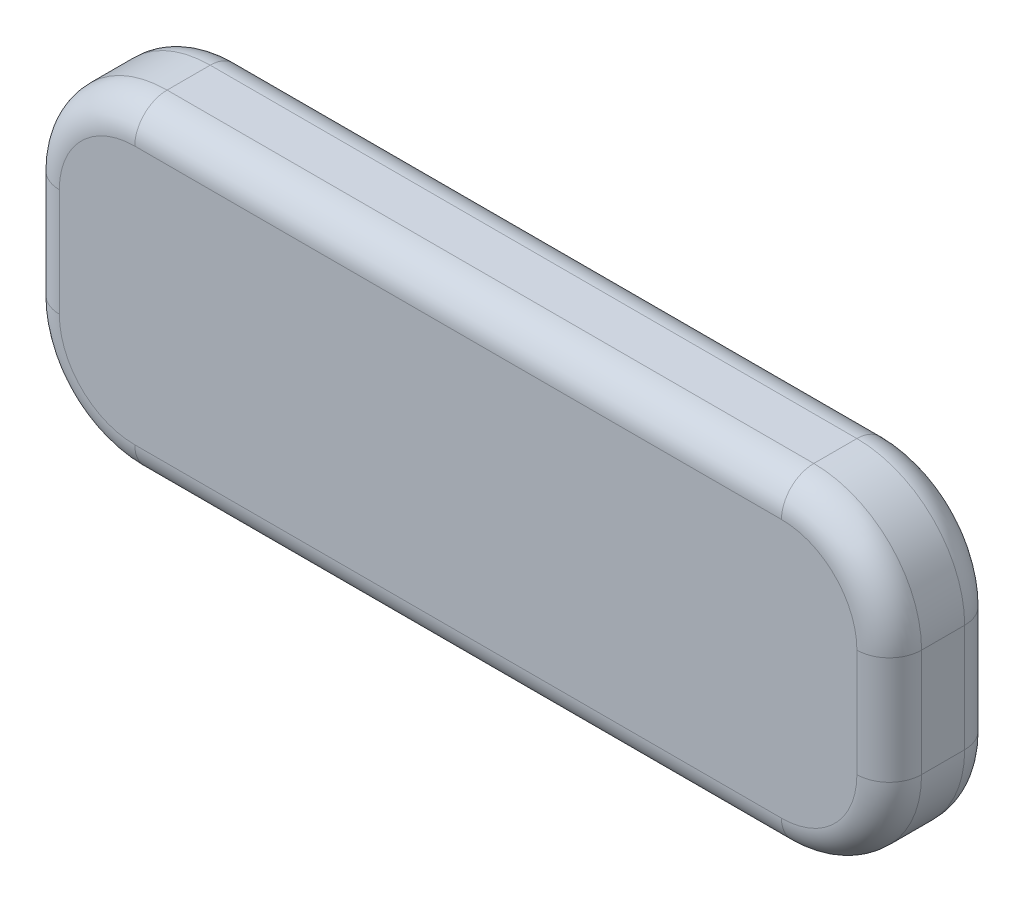
ISO-10303-21;
HEADER;
FILE_DESCRIPTION(('STEP AP214'),'2;1');
FILE_NAME('part.step','',(''),(''),'','','');
FILE_SCHEMA(('AUTOMOTIVE_DESIGN { 1 0 10303 214 1 1 1 1 }'));
ENDSEC;
DATA;
#1=APPLICATION_CONTEXT('core data for automotive mechanical design processes');
#2=APPLICATION_PROTOCOL_DEFINITION('international standard','automotive_design',2000,#1);
#3=PRODUCT_CONTEXT('',#1,'mechanical');
#4=PRODUCT('Part','Part','',(#3));
#5=PRODUCT_RELATED_PRODUCT_CATEGORY('part','',(#4));
#6=PRODUCT_DEFINITION_FORMATION('','',#4);
#7=PRODUCT_DEFINITION_CONTEXT('part definition',#1,'design');
#8=PRODUCT_DEFINITION('design','',#6,#7);
#9=PRODUCT_DEFINITION_SHAPE('','',#8);
#10=(LENGTH_UNIT() NAMED_UNIT(*) SI_UNIT(.MILLI.,.METRE.));
#11=(NAMED_UNIT(*) PLANE_ANGLE_UNIT() SI_UNIT($,.RADIAN.));
#12=(NAMED_UNIT(*) SI_UNIT($,.STERADIAN.) SOLID_ANGLE_UNIT());
#13=UNCERTAINTY_MEASURE_WITH_UNIT(LENGTH_MEASURE(1.E-05),#10,'distance_accuracy_value','');
#14=(GEOMETRIC_REPRESENTATION_CONTEXT(3) GLOBAL_UNCERTAINTY_ASSIGNED_CONTEXT((#13)) GLOBAL_UNIT_ASSIGNED_CONTEXT((#10,
#11,#12)) REPRESENTATION_CONTEXT('',''));
#15=CARTESIAN_POINT('',(0.,0.,0.));
#16=DIRECTION('',(0.,0.,1.));
#17=DIRECTION('',(1.,0.,0.));
#18=AXIS2_PLACEMENT_3D('',#15,#16,#17);
#19=CARTESIAN_POINT('',(-40.,-15.,10.));
#20=DIRECTION('',(1.,0.,0.));
#21=DIRECTION('',(0.,0.,-1.));
#22=AXIS2_PLACEMENT_3D('',#19,#20,#21);
#23=PLANE('',#22);
#24=DIRECTION('',(0.,0.,-1.));
#25=VECTOR('',#24,1.);
#26=CARTESIAN_POINT('',(-40.,5.,10.));
#27=LINE('',#26,#25);
#28=CARTESIAN_POINT('',(-40.,5.,7.));
#29=VERTEX_POINT('',#28);
#30=CARTESIAN_POINT('',(-40.,5.,3.));
#31=VERTEX_POINT('',#30);
#32=EDGE_CURVE('E179',#29,#31,#27,.T.);
#33=ORIENTED_EDGE('',*,*,#32,.T.);
#34=DIRECTION('',(0.,-1.,0.));
#35=VECTOR('',#34,1.);
#36=CARTESIAN_POINT('',(-40.,-15.,3.));
#37=LINE('',#36,#35);
#38=CARTESIAN_POINT('',(-40.,-5.,3.));
#39=VERTEX_POINT('',#38);
#40=EDGE_CURVE('E204',#31,#39,#37,.T.);
#41=ORIENTED_EDGE('',*,*,#40,.T.);
#42=DIRECTION('',(0.,0.,-1.));
#43=VECTOR('',#42,1.);
#44=CARTESIAN_POINT('',(-40.,-5.,10.));
#45=LINE('',#44,#43);
#46=CARTESIAN_POINT('',(-40.,-5.,7.));
#47=VERTEX_POINT('',#46);
#48=EDGE_CURVE('E182',#39,#47,#45,.F.);
#49=ORIENTED_EDGE('',*,*,#48,.T.);
#50=DIRECTION('',(0.,-1.,0.));
#51=VECTOR('',#50,1.);
#52=CARTESIAN_POINT('',(-40.,5.,7.));
#53=LINE('',#52,#51);
#54=EDGE_CURVE('E202',#47,#29,#53,.F.);
#55=ORIENTED_EDGE('',*,*,#54,.T.);
#56=EDGE_LOOP('',(#33,#41,#49,#55));
#57=FACE_BOUND('',#56,.T.);
#58=ADVANCED_FACE('F41',(#57),#23,.F.);
#59=CARTESIAN_POINT('',(40.,-15.,10.));
#60=DIRECTION('',(0.,1.,0.));
#61=DIRECTION('',(-1.,0.,0.));
#62=AXIS2_PLACEMENT_3D('',#59,#60,#61);
#63=PLANE('',#62);
#64=DIRECTION('',(0.,0.,-1.));
#65=VECTOR('',#64,1.);
#66=CARTESIAN_POINT('',(-30.,-15.,10.));
#67=LINE('',#66,#65);
#68=CARTESIAN_POINT('',(-30.,-15.,7.));
#69=VERTEX_POINT('',#68);
#70=CARTESIAN_POINT('',(-30.,-15.,3.));
#71=VERTEX_POINT('',#70);
#72=EDGE_CURVE('E294',#69,#71,#67,.T.);
#73=ORIENTED_EDGE('',*,*,#72,.T.);
#74=DIRECTION('',(1.,0.,0.));
#75=VECTOR('',#74,1.);
#76=CARTESIAN_POINT('',(40.,-15.,3.));
#77=LINE('',#76,#75);
#78=CARTESIAN_POINT('',(30.,-15.,3.));
#79=VERTEX_POINT('',#78);
#80=EDGE_CURVE('E11',#71,#79,#77,.T.);
#81=ORIENTED_EDGE('',*,*,#80,.T.);
#82=DIRECTION('',(0.,0.,-1.));
#83=VECTOR('',#82,1.);
#84=CARTESIAN_POINT('',(30.,-15.,10.));
#85=LINE('',#84,#83);
#86=CARTESIAN_POINT('',(30.,-15.,7.));
#87=VERTEX_POINT('',#86);
#88=EDGE_CURVE('E305',#79,#87,#85,.F.);
#89=ORIENTED_EDGE('',*,*,#88,.T.);
#90=DIRECTION('',(1.,0.,0.));
#91=VECTOR('',#90,1.);
#92=CARTESIAN_POINT('',(-30.,-15.,7.));
#93=LINE('',#92,#91);
#94=EDGE_CURVE('E50',#87,#69,#93,.F.);
#95=ORIENTED_EDGE('',*,*,#94,.T.);
#96=EDGE_LOOP('',(#73,#81,#89,#95));
#97=FACE_BOUND('',#96,.T.);
#98=ADVANCED_FACE('F343',(#97),#63,.F.);
#99=CARTESIAN_POINT('',(40.,-15.,10.));
#100=DIRECTION('',(-1.,0.,0.));
#101=DIRECTION('',(0.,0.,1.));
#102=AXIS2_PLACEMENT_3D('',#99,#100,#101);
#103=PLANE('',#102);
#104=DIRECTION('',(0.,0.,-1.));
#105=VECTOR('',#104,1.);
#106=CARTESIAN_POINT('',(40.,-4.99999999999999,10.));
#107=LINE('',#106,#105);
#108=CARTESIAN_POINT('',(40.,-4.99999999999999,7.));
#109=VERTEX_POINT('',#108);
#110=CARTESIAN_POINT('',(40.,-4.99999999999999,3.));
#111=VERTEX_POINT('',#110);
#112=EDGE_CURVE('E309',#109,#111,#107,.T.);
#113=ORIENTED_EDGE('',*,*,#112,.T.);
#114=DIRECTION('',(0.,1.,0.));
#115=VECTOR('',#114,1.);
#116=CARTESIAN_POINT('',(40.,-15.,3.));
#117=LINE('',#116,#115);
#118=CARTESIAN_POINT('',(40.,5.00000000000001,3.));
#119=VERTEX_POINT('',#118);
#120=EDGE_CURVE('E217',#111,#119,#117,.T.);
#121=ORIENTED_EDGE('',*,*,#120,.T.);
#122=DIRECTION('',(0.,0.,-1.));
#123=VECTOR('',#122,1.);
#124=CARTESIAN_POINT('',(40.,5.00000000000001,10.));
#125=LINE('',#124,#123);
#126=CARTESIAN_POINT('',(40.,5.00000000000001,7.));
#127=VERTEX_POINT('',#126);
#128=EDGE_CURVE('E257',#119,#127,#125,.F.);
#129=ORIENTED_EDGE('',*,*,#128,.T.);
#130=DIRECTION('',(0.,1.,0.));
#131=VECTOR('',#130,1.);
#132=CARTESIAN_POINT('',(40.,-4.99999999999999,7.));
#133=LINE('',#132,#131);
#134=EDGE_CURVE('E215',#127,#109,#133,.F.);
#135=ORIENTED_EDGE('',*,*,#134,.T.);
#136=EDGE_LOOP('',(#113,#121,#129,#135));
#137=FACE_BOUND('',#136,.T.);
#138=ADVANCED_FACE('F315',(#137),#103,.F.);
#139=CARTESIAN_POINT('',(40.,15.,10.));
#140=DIRECTION('',(0.,-1.,0.));
#141=DIRECTION('',(1.,0.,0.));
#142=AXIS2_PLACEMENT_3D('',#139,#140,#141);
#143=PLANE('',#142);
#144=DIRECTION('',(0.,0.,-1.));
#145=VECTOR('',#144,1.);
#146=CARTESIAN_POINT('',(30.,15.,10.));
#147=LINE('',#146,#145);
#148=CARTESIAN_POINT('',(30.,15.,7.));
#149=VERTEX_POINT('',#148);
#150=CARTESIAN_POINT('',(30.,15.,3.));
#151=VERTEX_POINT('',#150);
#152=EDGE_CURVE('E298',#149,#151,#147,.T.);
#153=ORIENTED_EDGE('',*,*,#152,.T.);
#154=DIRECTION('',(-1.,0.,0.));
#155=VECTOR('',#154,1.);
#156=CARTESIAN_POINT('',(40.,15.,3.));
#157=LINE('',#156,#155);
#158=CARTESIAN_POINT('',(-30.,15.,3.));
#159=VERTEX_POINT('',#158);
#160=EDGE_CURVE('E239',#151,#159,#157,.T.);
#161=ORIENTED_EDGE('',*,*,#160,.T.);
#162=DIRECTION('',(0.,0.,-1.));
#163=VECTOR('',#162,1.);
#164=CARTESIAN_POINT('',(-30.,15.,10.));
#165=LINE('',#164,#163);
#166=CARTESIAN_POINT('',(-30.,15.,7.));
#167=VERTEX_POINT('',#166);
#168=EDGE_CURVE('E300',#159,#167,#165,.F.);
#169=ORIENTED_EDGE('',*,*,#168,.T.);
#170=DIRECTION('',(-1.,0.,0.));
#171=VECTOR('',#170,1.);
#172=CARTESIAN_POINT('',(30.,15.,7.));
#173=LINE('',#172,#171);
#174=EDGE_CURVE('E237',#167,#149,#173,.F.);
#175=ORIENTED_EDGE('',*,*,#174,.T.);
#176=EDGE_LOOP('',(#153,#161,#169,#175));
#177=FACE_BOUND('',#176,.T.);
#178=ADVANCED_FACE('F582',(#177),#143,.F.);
#179=CARTESIAN_POINT('',(0.,0.,10.));
#180=DIRECTION('',(0.,0.,1.));
#181=DIRECTION('',(1.,0.,0.));
#182=AXIS2_PLACEMENT_3D('',#179,#180,#181);
#183=PLANE('',#182);
#184=CARTESIAN_POINT('',(30.,-4.99999999999999,10.));
#185=DIRECTION('',(0.,0.,1.));
#186=DIRECTION('',(1.,0.,0.));
#187=AXIS2_PLACEMENT_3D('',#184,#185,#186);
#188=CIRCLE('',#187,7.);
#189=CARTESIAN_POINT('',(30.,-12.,10.));
#190=VERTEX_POINT('',#189);
#191=CARTESIAN_POINT('',(37.,-4.99999999999999,10.));
#192=VERTEX_POINT('',#191);
#193=EDGE_CURVE('E58',#190,#192,#188,.T.);
#194=ORIENTED_EDGE('',*,*,#193,.T.);
#195=DIRECTION('',(0.,1.,0.));
#196=VECTOR('',#195,1.);
#197=CARTESIAN_POINT('',(37.,5.00000000000001,10.));
#198=LINE('',#197,#196);
#199=CARTESIAN_POINT('',(37.,5.00000000000001,10.));
#200=VERTEX_POINT('',#199);
#201=EDGE_CURVE('E235',#192,#200,#198,.T.);
#202=ORIENTED_EDGE('',*,*,#201,.T.);
#203=CARTESIAN_POINT('',(30.,5.00000000000001,10.));
#204=DIRECTION('',(0.,0.,1.));
#205=DIRECTION('',(1.,0.,0.));
#206=AXIS2_PLACEMENT_3D('',#203,#204,#205);
#207=CIRCLE('',#206,7.);
#208=CARTESIAN_POINT('',(30.,12.,10.));
#209=VERTEX_POINT('',#208);
#210=EDGE_CURVE('E230',#200,#209,#207,.T.);
#211=ORIENTED_EDGE('',*,*,#210,.T.);
#212=DIRECTION('',(-1.,0.,0.));
#213=VECTOR('',#212,1.);
#214=CARTESIAN_POINT('',(-30.,12.,10.));
#215=LINE('',#214,#213);
#216=CARTESIAN_POINT('',(-30.,12.,10.));
#217=VERTEX_POINT('',#216);
#218=EDGE_CURVE('E222',#209,#217,#215,.T.);
#219=ORIENTED_EDGE('',*,*,#218,.T.);
#220=CARTESIAN_POINT('',(-30.,5.,10.));
#221=DIRECTION('',(0.,0.,1.));
#222=DIRECTION('',(1.,0.,0.));
#223=AXIS2_PLACEMENT_3D('',#220,#221,#222);
#224=CIRCLE('',#223,7.);
#225=CARTESIAN_POINT('',(-37.,5.,10.));
#226=VERTEX_POINT('',#225);
#227=EDGE_CURVE('E224',#217,#226,#224,.T.);
#228=ORIENTED_EDGE('',*,*,#227,.T.);
#229=DIRECTION('',(0.,-1.,0.));
#230=VECTOR('',#229,1.);
#231=CARTESIAN_POINT('',(-37.,-5.,10.));
#232=LINE('',#231,#230);
#233=CARTESIAN_POINT('',(-37.,-5.,10.));
#234=VERTEX_POINT('',#233);
#235=EDGE_CURVE('E226',#226,#234,#232,.T.);
#236=ORIENTED_EDGE('',*,*,#235,.T.);
#237=CARTESIAN_POINT('',(-30.,-5.,10.));
#238=DIRECTION('',(0.,0.,1.));
#239=DIRECTION('',(1.,0.,0.));
#240=AXIS2_PLACEMENT_3D('',#237,#238,#239);
#241=CIRCLE('',#240,7.);
#242=CARTESIAN_POINT('',(-30.,-12.,10.));
#243=VERTEX_POINT('',#242);
#244=EDGE_CURVE('E228',#234,#243,#241,.T.);
#245=ORIENTED_EDGE('',*,*,#244,.T.);
#246=DIRECTION('',(1.,0.,0.));
#247=VECTOR('',#246,1.);
#248=CARTESIAN_POINT('',(30.,-12.,10.));
#249=LINE('',#248,#247);
#250=EDGE_CURVE('E63',#243,#190,#249,.T.);
#251=ORIENTED_EDGE('',*,*,#250,.T.);
#252=EDGE_LOOP('',(#194,#202,#211,#219,#228,#236,#245,#251));
#253=FACE_BOUND('',#252,.T.);
#254=ADVANCED_FACE('F572',(#253),#183,.T.);
#255=CARTESIAN_POINT('',(0.,0.,0.));
#256=DIRECTION('',(0.,0.,1.));
#257=DIRECTION('',(1.,0.,0.));
#258=AXIS2_PLACEMENT_3D('',#255,#256,#257);
#259=PLANE('',#258);
#260=CARTESIAN_POINT('',(-30.,-5.,0.));
#261=DIRECTION('',(0.,0.,1.));
#262=DIRECTION('',(1.,0.,0.));
#263=AXIS2_PLACEMENT_3D('',#260,#261,#262);
#264=CIRCLE('',#263,7.);
#265=CARTESIAN_POINT('',(-30.,-12.,0.));
#266=VERTEX_POINT('',#265);
#267=CARTESIAN_POINT('',(-37.,-5.,0.));
#268=VERTEX_POINT('',#267);
#269=EDGE_CURVE('E189',#266,#268,#264,.F.);
#270=ORIENTED_EDGE('',*,*,#269,.T.);
#271=DIRECTION('',(0.,-1.,0.));
#272=VECTOR('',#271,1.);
#273=CARTESIAN_POINT('',(-37.,0.,0.));
#274=LINE('',#273,#272);
#275=CARTESIAN_POINT('',(-37.,5.,0.));
#276=VERTEX_POINT('',#275);
#277=EDGE_CURVE('E195',#268,#276,#274,.F.);
#278=ORIENTED_EDGE('',*,*,#277,.T.);
#279=CARTESIAN_POINT('',(-30.,5.,0.));
#280=DIRECTION('',(0.,0.,1.));
#281=DIRECTION('',(1.,0.,0.));
#282=AXIS2_PLACEMENT_3D('',#279,#280,#281);
#283=CIRCLE('',#282,7.);
#284=CARTESIAN_POINT('',(-30.,12.,0.));
#285=VERTEX_POINT('',#284);
#286=EDGE_CURVE('E193',#276,#285,#283,.F.);
#287=ORIENTED_EDGE('',*,*,#286,.T.);
#288=DIRECTION('',(-1.,0.,0.));
#289=VECTOR('',#288,1.);
#290=CARTESIAN_POINT('',(0.,12.,0.));
#291=LINE('',#290,#289);
#292=CARTESIAN_POINT('',(30.,12.,0.));
#293=VERTEX_POINT('',#292);
#294=EDGE_CURVE('E191',#285,#293,#291,.F.);
#295=ORIENTED_EDGE('',*,*,#294,.T.);
#296=CARTESIAN_POINT('',(30.,5.00000000000001,0.));
#297=DIRECTION('',(0.,0.,1.));
#298=DIRECTION('',(1.,0.,0.));
#299=AXIS2_PLACEMENT_3D('',#296,#297,#298);
#300=CIRCLE('',#299,7.);
#301=CARTESIAN_POINT('',(37.,5.00000000000001,0.));
#302=VERTEX_POINT('',#301);
#303=EDGE_CURVE('E187',#293,#302,#300,.F.);
#304=ORIENTED_EDGE('',*,*,#303,.T.);
#305=DIRECTION('',(0.,1.,0.));
#306=VECTOR('',#305,1.);
#307=CARTESIAN_POINT('',(37.,0.,0.));
#308=LINE('',#307,#306);
#309=CARTESIAN_POINT('',(37.,-4.99999999999999,0.));
#310=VERTEX_POINT('',#309);
#311=EDGE_CURVE('E161',#302,#310,#308,.F.);
#312=ORIENTED_EDGE('',*,*,#311,.T.);
#313=CARTESIAN_POINT('',(30.,-4.99999999999999,0.));
#314=DIRECTION('',(0.,0.,1.));
#315=DIRECTION('',(1.,0.,0.));
#316=AXIS2_PLACEMENT_3D('',#313,#314,#315);
#317=CIRCLE('',#316,7.);
#318=CARTESIAN_POINT('',(30.,-12.,0.));
#319=VERTEX_POINT('',#318);
#320=EDGE_CURVE('E153',#310,#319,#317,.F.);
#321=ORIENTED_EDGE('',*,*,#320,.T.);
#322=DIRECTION('',(1.,0.,0.));
#323=VECTOR('',#322,1.);
#324=CARTESIAN_POINT('',(0.,-12.,0.));
#325=LINE('',#324,#323);
#326=EDGE_CURVE('E158',#319,#266,#325,.F.);
#327=ORIENTED_EDGE('',*,*,#326,.T.);
#328=EDGE_LOOP('',(#270,#278,#287,#295,#304,#312,#321,#327));
#329=FACE_BOUND('',#328,.T.);
#330=ADVANCED_FACE('F156',(#329),#259,.F.);
#331=CARTESIAN_POINT('',(30.,-4.99999999999999,10.));
#332=DIRECTION('',(0.,0.,-1.));
#333=DIRECTION('',(-1.,0.,0.));
#334=AXIS2_PLACEMENT_3D('',#331,#332,#333);
#335=CYLINDRICAL_SURFACE('',#334,10.);
#336=ORIENTED_EDGE('',*,*,#88,.F.);
#337=CARTESIAN_POINT('',(30.,-4.99999999999999,3.));
#338=DIRECTION('',(0.,0.,1.));
#339=DIRECTION('',(1.,0.,0.));
#340=AXIS2_PLACEMENT_3D('',#337,#338,#339);
#341=CIRCLE('',#340,10.);
#342=EDGE_CURVE('E170',#79,#111,#341,.T.);
#343=ORIENTED_EDGE('',*,*,#342,.T.);
#344=ORIENTED_EDGE('',*,*,#112,.F.);
#345=CARTESIAN_POINT('',(30.,-4.99999999999999,7.));
#346=DIRECTION('',(0.,0.,1.));
#347=DIRECTION('',(1.,0.,0.));
#348=AXIS2_PLACEMENT_3D('',#345,#346,#347);
#349=CIRCLE('',#348,10.);
#350=EDGE_CURVE('E219',#109,#87,#349,.F.);
#351=ORIENTED_EDGE('',*,*,#350,.T.);
#352=EDGE_LOOP('',(#336,#343,#344,#351));
#353=FACE_BOUND('',#352,.T.);
#354=ADVANCED_FACE('F352',(#353),#335,.T.);
#355=CARTESIAN_POINT('',(30.,5.00000000000001,10.));
#356=DIRECTION('',(0.,0.,-1.));
#357=DIRECTION('',(-1.,0.,0.));
#358=AXIS2_PLACEMENT_3D('',#355,#356,#357);
#359=CYLINDRICAL_SURFACE('',#358,10.);
#360=ORIENTED_EDGE('',*,*,#128,.F.);
#361=CARTESIAN_POINT('',(30.,5.00000000000001,3.));
#362=DIRECTION('',(0.,0.,1.));
#363=DIRECTION('',(1.,0.,0.));
#364=AXIS2_PLACEMENT_3D('',#361,#362,#363);
#365=CIRCLE('',#364,10.);
#366=EDGE_CURVE('E213',#119,#151,#365,.T.);
#367=ORIENTED_EDGE('',*,*,#366,.T.);
#368=ORIENTED_EDGE('',*,*,#152,.F.);
#369=CARTESIAN_POINT('',(30.,5.00000000000001,7.));
#370=DIRECTION('',(0.,0.,1.));
#371=DIRECTION('',(1.,0.,0.));
#372=AXIS2_PLACEMENT_3D('',#369,#370,#371);
#373=CIRCLE('',#372,10.);
#374=EDGE_CURVE('E210',#149,#127,#373,.F.);
#375=ORIENTED_EDGE('',*,*,#374,.T.);
#376=EDGE_LOOP('',(#360,#367,#368,#375));
#377=FACE_BOUND('',#376,.T.);
#378=ADVANCED_FACE('F321',(#377),#359,.T.);
#379=CARTESIAN_POINT('',(-30.,5.,10.));
#380=DIRECTION('',(0.,0.,-1.));
#381=DIRECTION('',(-1.,0.,0.));
#382=AXIS2_PLACEMENT_3D('',#379,#380,#381);
#383=CYLINDRICAL_SURFACE('',#382,10.);
#384=ORIENTED_EDGE('',*,*,#168,.F.);
#385=CARTESIAN_POINT('',(-30.,5.,3.));
#386=DIRECTION('',(0.,0.,1.));
#387=DIRECTION('',(1.,0.,0.));
#388=AXIS2_PLACEMENT_3D('',#385,#386,#387);
#389=CIRCLE('',#388,10.);
#390=EDGE_CURVE('E208',#159,#31,#389,.T.);
#391=ORIENTED_EDGE('',*,*,#390,.T.);
#392=ORIENTED_EDGE('',*,*,#32,.F.);
#393=CARTESIAN_POINT('',(-30.,5.,7.));
#394=DIRECTION('',(0.,0.,1.));
#395=DIRECTION('',(1.,0.,0.));
#396=AXIS2_PLACEMENT_3D('',#393,#394,#395);
#397=CIRCLE('',#396,10.);
#398=EDGE_CURVE('E206',#29,#167,#397,.F.);
#399=ORIENTED_EDGE('',*,*,#398,.T.);
#400=EDGE_LOOP('',(#384,#391,#392,#399));
#401=FACE_BOUND('',#400,.T.);
#402=ADVANCED_FACE('F358',(#401),#383,.T.);
#403=CARTESIAN_POINT('',(-30.,-5.,10.));
#404=DIRECTION('',(0.,0.,-1.));
#405=DIRECTION('',(-1.,0.,0.));
#406=AXIS2_PLACEMENT_3D('',#403,#404,#405);
#407=CYLINDRICAL_SURFACE('',#406,10.);
#408=ORIENTED_EDGE('',*,*,#48,.F.);
#409=CARTESIAN_POINT('',(-30.,-5.,3.));
#410=DIRECTION('',(0.,0.,1.));
#411=DIRECTION('',(1.,0.,0.));
#412=AXIS2_PLACEMENT_3D('',#409,#410,#411);
#413=CIRCLE('',#412,10.);
#414=EDGE_CURVE('E199',#39,#71,#413,.T.);
#415=ORIENTED_EDGE('',*,*,#414,.T.);
#416=ORIENTED_EDGE('',*,*,#72,.F.);
#417=CARTESIAN_POINT('',(-30.,-5.,7.));
#418=DIRECTION('',(0.,0.,1.));
#419=DIRECTION('',(1.,0.,0.));
#420=AXIS2_PLACEMENT_3D('',#417,#418,#419);
#421=CIRCLE('',#420,10.);
#422=EDGE_CURVE('E197',#69,#47,#421,.F.);
#423=ORIENTED_EDGE('',*,*,#422,.T.);
#424=EDGE_LOOP('',(#408,#415,#416,#423));
#425=FACE_BOUND('',#424,.T.);
#426=ADVANCED_FACE('F291',(#425),#407,.T.);
#427=CARTESIAN_POINT('',(30.,5.00000000000001,3.));
#428=DIRECTION('',(0.,0.,1.));
#429=DIRECTION('',(1.,0.,0.));
#430=AXIS2_PLACEMENT_3D('',#427,#428,#429);
#431=TOROIDAL_SURFACE('',#430,7.,3.);
#432=CARTESIAN_POINT('',(30.,12.,3.));
#433=DIRECTION('',(-1.,0.,0.));
#434=DIRECTION('',(0.,0.,1.));
#435=AXIS2_PLACEMENT_3D('',#432,#433,#434);
#436=CIRCLE('',#435,3.);
#437=EDGE_CURVE('E251',#151,#293,#436,.T.);
#438=ORIENTED_EDGE('',*,*,#437,.F.);
#439=ORIENTED_EDGE('',*,*,#366,.F.);
#440=CARTESIAN_POINT('',(37.,5.00000000000001,3.));
#441=DIRECTION('',(0.,-1.,0.));
#442=DIRECTION('',(0.,0.,-1.));
#443=AXIS2_PLACEMENT_3D('',#440,#441,#442);
#444=CIRCLE('',#443,3.);
#445=EDGE_CURVE('E254',#302,#119,#444,.T.);
#446=ORIENTED_EDGE('',*,*,#445,.F.);
#447=ORIENTED_EDGE('',*,*,#303,.F.);
#448=EDGE_LOOP('',(#438,#439,#446,#447));
#449=FACE_BOUND('',#448,.T.);
#450=ADVANCED_FACE('F327',(#449),#431,.T.);
#451=CARTESIAN_POINT('',(37.,-15.,3.));
#452=DIRECTION('',(0.,1.,0.));
#453=DIRECTION('',(0.,0.,1.));
#454=AXIS2_PLACEMENT_3D('',#451,#452,#453);
#455=CYLINDRICAL_SURFACE('',#454,3.);
#456=ORIENTED_EDGE('',*,*,#445,.T.);
#457=ORIENTED_EDGE('',*,*,#120,.F.);
#458=CARTESIAN_POINT('',(37.,-4.99999999999999,3.));
#459=DIRECTION('',(0.,-1.,0.));
#460=DIRECTION('',(0.,0.,-1.));
#461=AXIS2_PLACEMENT_3D('',#458,#459,#460);
#462=CIRCLE('',#461,3.);
#463=EDGE_CURVE('E249',#310,#111,#462,.T.);
#464=ORIENTED_EDGE('',*,*,#463,.F.);
#465=ORIENTED_EDGE('',*,*,#311,.F.);
#466=EDGE_LOOP('',(#456,#457,#464,#465));
#467=FACE_BOUND('',#466,.T.);
#468=ADVANCED_FACE('F331',(#467),#455,.T.);
#469=CARTESIAN_POINT('',(40.,12.,3.));
#470=DIRECTION('',(-1.,0.,0.));
#471=DIRECTION('',(0.,-1.,0.));
#472=AXIS2_PLACEMENT_3D('',#469,#470,#471);
#473=CYLINDRICAL_SURFACE('',#472,3.);
#474=ORIENTED_EDGE('',*,*,#437,.T.);
#475=ORIENTED_EDGE('',*,*,#294,.F.);
#476=CARTESIAN_POINT('',(-30.,12.,3.));
#477=DIRECTION('',(-1.,0.,0.));
#478=DIRECTION('',(0.,0.,1.));
#479=AXIS2_PLACEMENT_3D('',#476,#477,#478);
#480=CIRCLE('',#479,3.);
#481=EDGE_CURVE('E173',#159,#285,#480,.T.);
#482=ORIENTED_EDGE('',*,*,#481,.F.);
#483=ORIENTED_EDGE('',*,*,#160,.F.);
#484=EDGE_LOOP('',(#474,#475,#482,#483));
#485=FACE_BOUND('',#484,.T.);
#486=ADVANCED_FACE('F333',(#485),#473,.T.);
#487=CARTESIAN_POINT('',(30.,-4.99999999999999,3.));
#488=DIRECTION('',(0.,0.,1.));
#489=DIRECTION('',(1.,0.,0.));
#490=AXIS2_PLACEMENT_3D('',#487,#488,#489);
#491=TOROIDAL_SURFACE('',#490,7.,3.);
#492=ORIENTED_EDGE('',*,*,#463,.T.);
#493=ORIENTED_EDGE('',*,*,#342,.F.);
#494=CARTESIAN_POINT('',(30.,-12.,3.));
#495=DIRECTION('',(-1.,0.,0.));
#496=DIRECTION('',(0.,0.,1.));
#497=AXIS2_PLACEMENT_3D('',#494,#495,#496);
#498=CIRCLE('',#497,3.);
#499=EDGE_CURVE('E168',#319,#79,#498,.T.);
#500=ORIENTED_EDGE('',*,*,#499,.F.);
#501=ORIENTED_EDGE('',*,*,#320,.F.);
#502=EDGE_LOOP('',(#492,#493,#500,#501));
#503=FACE_BOUND('',#502,.T.);
#504=ADVANCED_FACE('F169',(#503),#491,.T.);
#505=CARTESIAN_POINT('',(-30.,5.,3.));
#506=DIRECTION('',(0.,0.,1.));
#507=DIRECTION('',(1.,0.,0.));
#508=AXIS2_PLACEMENT_3D('',#505,#506,#507);
#509=TOROIDAL_SURFACE('',#508,7.,3.);
#510=ORIENTED_EDGE('',*,*,#481,.T.);
#511=ORIENTED_EDGE('',*,*,#286,.F.);
#512=CARTESIAN_POINT('',(-37.,5.,3.));
#513=DIRECTION('',(0.,-1.,0.));
#514=DIRECTION('',(0.,0.,-1.));
#515=AXIS2_PLACEMENT_3D('',#512,#513,#514);
#516=CIRCLE('',#515,3.);
#517=EDGE_CURVE('E174',#31,#276,#516,.T.);
#518=ORIENTED_EDGE('',*,*,#517,.F.);
#519=ORIENTED_EDGE('',*,*,#390,.F.);
#520=EDGE_LOOP('',(#510,#511,#518,#519));
#521=FACE_BOUND('',#520,.T.);
#522=ADVANCED_FACE('F374',(#521),#509,.T.);
#523=CARTESIAN_POINT('',(40.,-12.,3.));
#524=DIRECTION('',(1.,0.,0.));
#525=DIRECTION('',(0.,1.,0.));
#526=AXIS2_PLACEMENT_3D('',#523,#524,#525);
#527=CYLINDRICAL_SURFACE('',#526,3.);
#528=ORIENTED_EDGE('',*,*,#499,.T.);
#529=ORIENTED_EDGE('',*,*,#80,.F.);
#530=CARTESIAN_POINT('',(-30.,-12.,3.));
#531=DIRECTION('',(-1.,0.,0.));
#532=DIRECTION('',(0.,0.,1.));
#533=AXIS2_PLACEMENT_3D('',#530,#531,#532);
#534=CIRCLE('',#533,3.);
#535=EDGE_CURVE('E177',#266,#71,#534,.T.);
#536=ORIENTED_EDGE('',*,*,#535,.F.);
#537=ORIENTED_EDGE('',*,*,#326,.F.);
#538=EDGE_LOOP('',(#528,#529,#536,#537));
#539=FACE_BOUND('',#538,.T.);
#540=ADVANCED_FACE('F176',(#539),#527,.T.);
#541=CARTESIAN_POINT('',(-37.,-15.,3.));
#542=DIRECTION('',(0.,-1.,0.));
#543=DIRECTION('',(0.,0.,-1.));
#544=AXIS2_PLACEMENT_3D('',#541,#542,#543);
#545=CYLINDRICAL_SURFACE('',#544,3.);
#546=ORIENTED_EDGE('',*,*,#517,.T.);
#547=ORIENTED_EDGE('',*,*,#277,.F.);
#548=CARTESIAN_POINT('',(-37.,-5.,3.));
#549=DIRECTION('',(0.,-1.,0.));
#550=DIRECTION('',(0.,0.,-1.));
#551=AXIS2_PLACEMENT_3D('',#548,#549,#550);
#552=CIRCLE('',#551,3.);
#553=EDGE_CURVE('E242',#39,#268,#552,.T.);
#554=ORIENTED_EDGE('',*,*,#553,.F.);
#555=ORIENTED_EDGE('',*,*,#40,.F.);
#556=EDGE_LOOP('',(#546,#547,#554,#555));
#557=FACE_BOUND('',#556,.T.);
#558=ADVANCED_FACE('F367',(#557),#545,.T.);
#559=CARTESIAN_POINT('',(-30.,-5.,3.));
#560=DIRECTION('',(0.,0.,1.));
#561=DIRECTION('',(1.,0.,0.));
#562=AXIS2_PLACEMENT_3D('',#559,#560,#561);
#563=TOROIDAL_SURFACE('',#562,7.,3.);
#564=ORIENTED_EDGE('',*,*,#535,.T.);
#565=ORIENTED_EDGE('',*,*,#414,.F.);
#566=ORIENTED_EDGE('',*,*,#553,.T.);
#567=ORIENTED_EDGE('',*,*,#269,.F.);
#568=EDGE_LOOP('',(#564,#565,#566,#567));
#569=FACE_BOUND('',#568,.T.);
#570=ADVANCED_FACE('F364',(#569),#563,.T.);
#571=CARTESIAN_POINT('',(-30.,-5.,7.));
#572=DIRECTION('',(0.,0.,1.));
#573=DIRECTION('',(1.,0.,0.));
#574=AXIS2_PLACEMENT_3D('',#571,#572,#573);
#575=TOROIDAL_SURFACE('',#574,7.,3.);
#576=CARTESIAN_POINT('',(-37.,-5.,7.));
#577=DIRECTION('',(0.,1.,0.));
#578=DIRECTION('',(0.,0.,1.));
#579=AXIS2_PLACEMENT_3D('',#576,#577,#578);
#580=CIRCLE('',#579,3.);
#581=EDGE_CURVE('E273',#47,#234,#580,.T.);
#582=ORIENTED_EDGE('',*,*,#581,.F.);
#583=ORIENTED_EDGE('',*,*,#422,.F.);
#584=CARTESIAN_POINT('',(-30.,-12.,7.));
#585=DIRECTION('',(1.,0.,0.));
#586=DIRECTION('',(0.,0.,-1.));
#587=AXIS2_PLACEMENT_3D('',#584,#585,#586);
#588=CIRCLE('',#587,3.);
#589=EDGE_CURVE('E45',#243,#69,#588,.T.);
#590=ORIENTED_EDGE('',*,*,#589,.F.);
#591=ORIENTED_EDGE('',*,*,#244,.F.);
#592=EDGE_LOOP('',(#582,#583,#590,#591));
#593=FACE_BOUND('',#592,.T.);
#594=ADVANCED_FACE('F43',(#593),#575,.T.);
#595=CARTESIAN_POINT('',(0.,-12.,7.));
#596=DIRECTION('',(-1.,0.,0.));
#597=DIRECTION('',(0.,-1.,0.));
#598=AXIS2_PLACEMENT_3D('',#595,#596,#597);
#599=CYLINDRICAL_SURFACE('',#598,3.);
#600=ORIENTED_EDGE('',*,*,#589,.T.);
#601=ORIENTED_EDGE('',*,*,#94,.F.);
#602=CARTESIAN_POINT('',(30.,-12.,7.));
#603=DIRECTION('',(1.,0.,0.));
#604=DIRECTION('',(0.,0.,-1.));
#605=AXIS2_PLACEMENT_3D('',#602,#603,#604);
#606=CIRCLE('',#605,3.);
#607=EDGE_CURVE('E271',#190,#87,#606,.T.);
#608=ORIENTED_EDGE('',*,*,#607,.F.);
#609=ORIENTED_EDGE('',*,*,#250,.F.);
#610=EDGE_LOOP('',(#600,#601,#608,#609));
#611=FACE_BOUND('',#610,.T.);
#612=ADVANCED_FACE('F283',(#611),#599,.T.);
#613=CARTESIAN_POINT('',(-37.,0.,7.));
#614=DIRECTION('',(0.,1.,0.));
#615=DIRECTION('',(0.,0.,1.));
#616=AXIS2_PLACEMENT_3D('',#613,#614,#615);
#617=CYLINDRICAL_SURFACE('',#616,3.);
#618=ORIENTED_EDGE('',*,*,#581,.T.);
#619=ORIENTED_EDGE('',*,*,#235,.F.);
#620=CARTESIAN_POINT('',(-37.,5.,7.));
#621=DIRECTION('',(0.,1.,0.));
#622=DIRECTION('',(0.,0.,1.));
#623=AXIS2_PLACEMENT_3D('',#620,#621,#622);
#624=CIRCLE('',#623,3.);
#625=EDGE_CURVE('E268',#29,#226,#624,.T.);
#626=ORIENTED_EDGE('',*,*,#625,.F.);
#627=ORIENTED_EDGE('',*,*,#54,.F.);
#628=EDGE_LOOP('',(#618,#619,#626,#627));
#629=FACE_BOUND('',#628,.T.);
#630=ADVANCED_FACE('F410',(#629),#617,.T.);
#631=CARTESIAN_POINT('',(30.,-4.99999999999999,7.));
#632=DIRECTION('',(0.,0.,1.));
#633=DIRECTION('',(1.,0.,0.));
#634=AXIS2_PLACEMENT_3D('',#631,#632,#633);
#635=TOROIDAL_SURFACE('',#634,7.,3.);
#636=ORIENTED_EDGE('',*,*,#607,.T.);
#637=ORIENTED_EDGE('',*,*,#350,.F.);
#638=CARTESIAN_POINT('',(37.,-4.99999999999999,7.));
#639=DIRECTION('',(0.,1.,0.));
#640=DIRECTION('',(0.,0.,1.));
#641=AXIS2_PLACEMENT_3D('',#638,#639,#640);
#642=CIRCLE('',#641,3.);
#643=EDGE_CURVE('E265',#192,#109,#642,.T.);
#644=ORIENTED_EDGE('',*,*,#643,.F.);
#645=ORIENTED_EDGE('',*,*,#193,.F.);
#646=EDGE_LOOP('',(#636,#637,#644,#645));
#647=FACE_BOUND('',#646,.T.);
#648=ADVANCED_FACE('F416',(#647),#635,.T.);
#649=CARTESIAN_POINT('',(-30.,5.,7.));
#650=DIRECTION('',(0.,0.,1.));
#651=DIRECTION('',(1.,0.,0.));
#652=AXIS2_PLACEMENT_3D('',#649,#650,#651);
#653=TOROIDAL_SURFACE('',#652,7.,3.);
#654=ORIENTED_EDGE('',*,*,#625,.T.);
#655=ORIENTED_EDGE('',*,*,#227,.F.);
#656=CARTESIAN_POINT('',(-30.,12.,7.));
#657=DIRECTION('',(1.,0.,0.));
#658=DIRECTION('',(0.,1.,0.));
#659=AXIS2_PLACEMENT_3D('',#656,#657,#658);
#660=CIRCLE('',#659,3.);
#661=EDGE_CURVE('E262',#167,#217,#660,.T.);
#662=ORIENTED_EDGE('',*,*,#661,.F.);
#663=ORIENTED_EDGE('',*,*,#398,.F.);
#664=EDGE_LOOP('',(#654,#655,#662,#663));
#665=FACE_BOUND('',#664,.T.);
#666=ADVANCED_FACE('F423',(#665),#653,.T.);
#667=CARTESIAN_POINT('',(37.,0.,7.));
#668=DIRECTION('',(0.,-1.,0.));
#669=DIRECTION('',(0.,0.,-1.));
#670=AXIS2_PLACEMENT_3D('',#667,#668,#669);
#671=CYLINDRICAL_SURFACE('',#670,3.);
#672=ORIENTED_EDGE('',*,*,#643,.T.);
#673=ORIENTED_EDGE('',*,*,#134,.F.);
#674=CARTESIAN_POINT('',(37.,5.00000000000001,7.));
#675=DIRECTION('',(0.,1.,0.));
#676=DIRECTION('',(0.,0.,1.));
#677=AXIS2_PLACEMENT_3D('',#674,#675,#676);
#678=CIRCLE('',#677,3.);
#679=EDGE_CURVE('E260',#200,#127,#678,.T.);
#680=ORIENTED_EDGE('',*,*,#679,.F.);
#681=ORIENTED_EDGE('',*,*,#201,.F.);
#682=EDGE_LOOP('',(#672,#673,#680,#681));
#683=FACE_BOUND('',#682,.T.);
#684=ADVANCED_FACE('F431',(#683),#671,.T.);
#685=CARTESIAN_POINT('',(0.,12.,7.));
#686=DIRECTION('',(1.,0.,0.));
#687=DIRECTION('',(0.,1.,0.));
#688=AXIS2_PLACEMENT_3D('',#685,#686,#687);
#689=CYLINDRICAL_SURFACE('',#688,3.);
#690=ORIENTED_EDGE('',*,*,#661,.T.);
#691=ORIENTED_EDGE('',*,*,#218,.F.);
#692=CARTESIAN_POINT('',(30.,12.,7.));
#693=DIRECTION('',(1.,0.,0.));
#694=DIRECTION('',(0.,0.,-1.));
#695=AXIS2_PLACEMENT_3D('',#692,#693,#694);
#696=CIRCLE('',#695,3.);
#697=EDGE_CURVE('E258',#149,#209,#696,.T.);
#698=ORIENTED_EDGE('',*,*,#697,.F.);
#699=ORIENTED_EDGE('',*,*,#174,.F.);
#700=EDGE_LOOP('',(#690,#691,#698,#699));
#701=FACE_BOUND('',#700,.T.);
#702=ADVANCED_FACE('F439',(#701),#689,.T.);
#703=CARTESIAN_POINT('',(30.,5.00000000000001,7.));
#704=DIRECTION('',(0.,0.,1.));
#705=DIRECTION('',(1.,0.,0.));
#706=AXIS2_PLACEMENT_3D('',#703,#704,#705);
#707=TOROIDAL_SURFACE('',#706,7.,3.);
#708=ORIENTED_EDGE('',*,*,#679,.T.);
#709=ORIENTED_EDGE('',*,*,#374,.F.);
#710=ORIENTED_EDGE('',*,*,#697,.T.);
#711=ORIENTED_EDGE('',*,*,#210,.F.);
#712=EDGE_LOOP('',(#708,#709,#710,#711));
#713=FACE_BOUND('',#712,.T.);
#714=ADVANCED_FACE('F447',(#713),#707,.T.);
#715=CLOSED_SHELL('',(#58,#98,#138,#178,#254,#330,#354,#378,#402,#426,#450,#468,#486,#504,#522,
#540,#558,#570,#594,#612,#630,#648,#666,#684,#702,#714));
#716=MANIFOLD_SOLID_BREP('B2',#715);
#717=ADVANCED_BREP_SHAPE_REPRESENTATION('',(#18,#716),#14);
#718=SHAPE_DEFINITION_REPRESENTATION(#9,#717);
ENDSEC;
END-ISO-10303-21;
